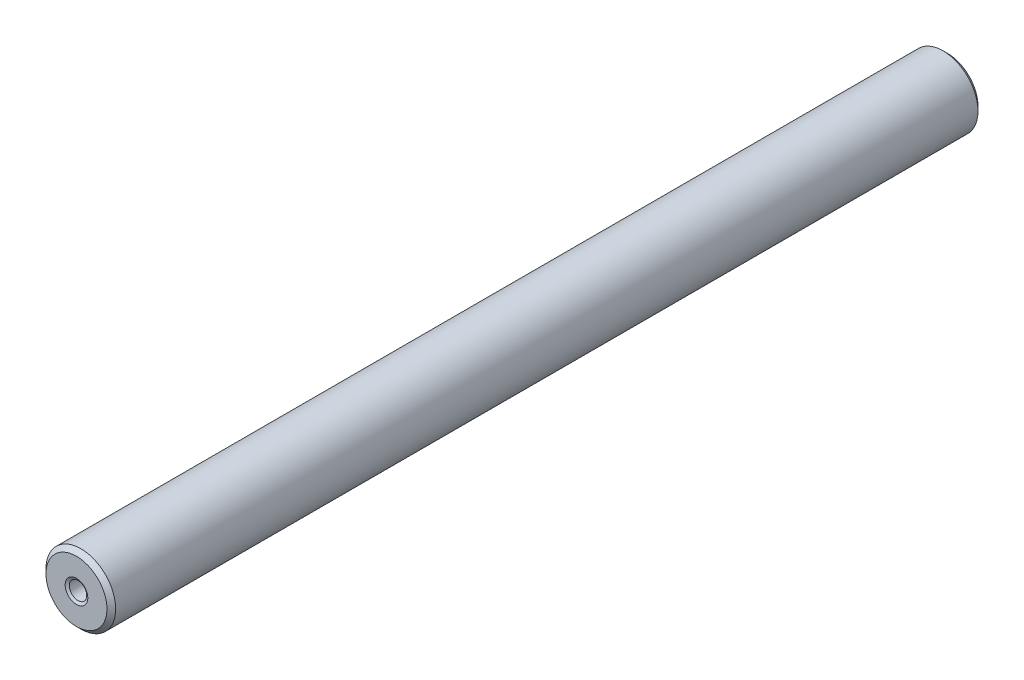
ISO-10303-21;
HEADER;
FILE_DESCRIPTION(('STEP AP214'),'2;1');
FILE_NAME('part.step','',(''),(''),'','','');
FILE_SCHEMA(('AUTOMOTIVE_DESIGN { 1 0 10303 214 1 1 1 1 }'));
ENDSEC;
DATA;
#1=APPLICATION_CONTEXT('core data for automotive mechanical design processes');
#2=APPLICATION_PROTOCOL_DEFINITION('international standard','automotive_design',2000,#1);
#3=PRODUCT_CONTEXT('',#1,'mechanical');
#4=PRODUCT('Part','Part','',(#3));
#5=PRODUCT_RELATED_PRODUCT_CATEGORY('part','',(#4));
#6=PRODUCT_DEFINITION_FORMATION('','',#4);
#7=PRODUCT_DEFINITION_CONTEXT('part definition',#1,'design');
#8=PRODUCT_DEFINITION('design','',#6,#7);
#9=PRODUCT_DEFINITION_SHAPE('','',#8);
#10=(LENGTH_UNIT() NAMED_UNIT(*) SI_UNIT(.MILLI.,.METRE.));
#11=(NAMED_UNIT(*) PLANE_ANGLE_UNIT() SI_UNIT($,.RADIAN.));
#12=(NAMED_UNIT(*) SI_UNIT($,.STERADIAN.) SOLID_ANGLE_UNIT());
#13=UNCERTAINTY_MEASURE_WITH_UNIT(LENGTH_MEASURE(1.E-05),#10,'distance_accuracy_value','');
#14=(GEOMETRIC_REPRESENTATION_CONTEXT(3) GLOBAL_UNCERTAINTY_ASSIGNED_CONTEXT((#13)) GLOBAL_UNIT_ASSIGNED_CONTEXT((#10,
#11,#12)) REPRESENTATION_CONTEXT('',''));
#15=CARTESIAN_POINT('',(0.,0.,0.));
#16=DIRECTION('',(0.,0.,1.));
#17=DIRECTION('',(1.,0.,0.));
#18=AXIS2_PLACEMENT_3D('',#15,#16,#17);
#19=CARTESIAN_POINT('',(0.,0.,98.));
#20=DIRECTION('',(0.,0.,1.));
#21=DIRECTION('',(1.,0.,0.));
#22=AXIS2_PLACEMENT_3D('',#19,#20,#21);
#23=CYLINDRICAL_SURFACE('',#22,1.);
#24=CARTESIAN_POINT('',(0.,0.,1.8267949192431));
#25=DIRECTION('',(0.,0.,1.));
#26=DIRECTION('',(1.,0.,0.));
#27=AXIS2_PLACEMENT_3D('',#24,#25,#26);
#28=CIRCLE('',#27,1.);
#29=CARTESIAN_POINT('',(1.,0.,1.8267949192431));
#30=VERTEX_POINT('',#29);
#31=EDGE_CURVE('E56',#30,#30,#28,.T.);
#32=ORIENTED_EDGE('',*,*,#31,.T.);
#33=EDGE_LOOP('',(#32));
#34=FACE_BOUND('',#33,.T.);
#35=CARTESIAN_POINT('',(0.,0.,0.300000000000009));
#36=DIRECTION('',(0.,0.,1.));
#37=DIRECTION('',(1.,0.,0.));
#38=AXIS2_PLACEMENT_3D('',#35,#36,#37);
#39=CIRCLE('',#38,1.);
#40=CARTESIAN_POINT('',(1.,0.,0.300000000000008));
#41=VERTEX_POINT('',#40);
#42=EDGE_CURVE('E59',#41,#41,#39,.F.);
#43=ORIENTED_EDGE('',*,*,#42,.T.);
#44=EDGE_LOOP('',(#43));
#45=FACE_BOUND('',#44,.T.);
#46=ADVANCED_FACE('F30',(#34,#45),#23,.F.);
#47=CARTESIAN_POINT('',(-1.,0.,0.));
#48=DIRECTION('',(0.,0.,1.));
#49=DIRECTION('',(1.,0.,0.));
#50=AXIS2_PLACEMENT_3D('',#47,#48,#49);
#51=PLANE('',#50);
#52=CARTESIAN_POINT('',(0.,0.,0.));
#53=DIRECTION('',(0.,0.,1.));
#54=DIRECTION('',(1.,0.,0.));
#55=AXIS2_PLACEMENT_3D('',#52,#53,#54);
#56=CIRCLE('',#55,1.17320508075688);
#57=CARTESIAN_POINT('',(1.17320508075688,0.,0.));
#58=VERTEX_POINT('',#57);
#59=EDGE_CURVE('E50',#58,#58,#56,.T.);
#60=ORIENTED_EDGE('',*,*,#59,.T.);
#61=EDGE_LOOP('',(#60));
#62=FACE_BOUND('',#61,.T.);
#63=CARTESIAN_POINT('',(0.,0.,0.));
#64=DIRECTION('',(0.,0.,1.));
#65=DIRECTION('',(1.,0.,0.));
#66=AXIS2_PLACEMENT_3D('',#63,#64,#65);
#67=CIRCLE('',#66,3.5);
#68=CARTESIAN_POINT('',(3.5,0.,0.));
#69=VERTEX_POINT('',#68);
#70=EDGE_CURVE('E65',#69,#69,#67,.F.);
#71=ORIENTED_EDGE('',*,*,#70,.T.);
#72=EDGE_LOOP('',(#71));
#73=FACE_BOUND('',#72,.T.);
#74=ADVANCED_FACE('F95',(#62,#73),#51,.F.);
#75=CARTESIAN_POINT('',(0.,0.,98.));
#76=DIRECTION('',(0.,0.,1.));
#77=DIRECTION('',(1.,0.,0.));
#78=AXIS2_PLACEMENT_3D('',#75,#76,#77);
#79=CYLINDRICAL_SURFACE('',#78,4.);
#80=CARTESIAN_POINT('',(0.,0.,0.5));
#81=DIRECTION('',(0.,0.,1.));
#82=DIRECTION('',(1.,0.,0.));
#83=AXIS2_PLACEMENT_3D('',#80,#81,#82);
#84=CIRCLE('',#83,4.);
#85=CARTESIAN_POINT('',(4.,0.,0.5));
#86=VERTEX_POINT('',#85);
#87=EDGE_CURVE('E68',#86,#86,#84,.T.);
#88=ORIENTED_EDGE('',*,*,#87,.T.);
#89=EDGE_LOOP('',(#88));
#90=FACE_BOUND('',#89,.T.);
#91=CARTESIAN_POINT('',(0.,0.,99.5));
#92=DIRECTION('',(0.,0.,-1.));
#93=DIRECTION('',(-1.,0.,0.));
#94=AXIS2_PLACEMENT_3D('',#91,#92,#93);
#95=CIRCLE('',#94,4.);
#96=CARTESIAN_POINT('',(-3.99999999999999,0.,99.5));
#97=VERTEX_POINT('',#96);
#98=EDGE_CURVE('E71',#97,#97,#95,.T.);
#99=ORIENTED_EDGE('',*,*,#98,.T.);
#100=EDGE_LOOP('',(#99));
#101=FACE_BOUND('',#100,.T.);
#102=ADVANCED_FACE('F75',(#90,#101),#79,.T.);
#103=CARTESIAN_POINT('',(-3.99999999999999,0.,100.));
#104=DIRECTION('',(0.,0.,-1.));
#105=DIRECTION('',(-1.,0.,0.));
#106=AXIS2_PLACEMENT_3D('',#103,#104,#105);
#107=PLANE('',#106);
#108=CARTESIAN_POINT('',(0.,0.,100.));
#109=DIRECTION('',(0.,0.,-1.));
#110=DIRECTION('',(-1.,0.,0.));
#111=AXIS2_PLACEMENT_3D('',#108,#109,#110);
#112=CIRCLE('',#111,1.29999999999999);
#113=CARTESIAN_POINT('',(-1.29999999999998,0.,100.));
#114=VERTEX_POINT('',#113);
#115=EDGE_CURVE('E10',#114,#114,#112,.T.);
#116=ORIENTED_EDGE('',*,*,#115,.T.);
#117=EDGE_LOOP('',(#116));
#118=FACE_BOUND('',#117,.T.);
#119=CARTESIAN_POINT('',(0.,0.,100.));
#120=DIRECTION('',(0.,0.,-1.));
#121=DIRECTION('',(-1.,0.,0.));
#122=AXIS2_PLACEMENT_3D('',#119,#120,#121);
#123=CIRCLE('',#122,3.49999999999999);
#124=CARTESIAN_POINT('',(-3.49999999999997,0.,100.));
#125=VERTEX_POINT('',#124);
#126=EDGE_CURVE('E62',#125,#125,#123,.F.);
#127=ORIENTED_EDGE('',*,*,#126,.T.);
#128=EDGE_LOOP('',(#127));
#129=FACE_BOUND('',#128,.T.);
#130=ADVANCED_FACE('F85',(#118,#129),#107,.F.);
#131=CARTESIAN_POINT('',(0.,0.,98.));
#132=DIRECTION('',(0.,0.,1.));
#133=DIRECTION('',(1.,0.,0.));
#134=AXIS2_PLACEMENT_3D('',#131,#132,#133);
#135=CYLINDRICAL_SURFACE('',#134,1.);
#136=CARTESIAN_POINT('',(0.,0.,98.3));
#137=DIRECTION('',(0.,0.,-1.));
#138=DIRECTION('',(-1.,0.,0.));
#139=AXIS2_PLACEMENT_3D('',#136,#137,#138);
#140=CIRCLE('',#139,1.);
#141=CARTESIAN_POINT('',(-0.999999999999988,0.,98.3));
#142=VERTEX_POINT('',#141);
#143=EDGE_CURVE('E37',#142,#142,#140,.T.);
#144=ORIENTED_EDGE('',*,*,#143,.T.);
#145=EDGE_LOOP('',(#144));
#146=FACE_BOUND('',#145,.T.);
#147=CARTESIAN_POINT('',(0.,0.,99.8267949192431));
#148=DIRECTION('',(0.,0.,-1.));
#149=DIRECTION('',(-1.,0.,0.));
#150=AXIS2_PLACEMENT_3D('',#147,#148,#149);
#151=CIRCLE('',#150,1.);
#152=CARTESIAN_POINT('',(-0.999999999999988,0.,99.8267949192431));
#153=VERTEX_POINT('',#152);
#154=EDGE_CURVE('E41',#153,#153,#151,.F.);
#155=ORIENTED_EDGE('',*,*,#154,.T.);
#156=EDGE_LOOP('',(#155));
#157=FACE_BOUND('',#156,.T.);
#158=ADVANCED_FACE('F87',(#146,#157),#135,.F.);
#159=CARTESIAN_POINT('',(0.,0.,98.));
#160=DIRECTION('',(0.,0.,-1.));
#161=DIRECTION('',(-1.,0.,0.));
#162=AXIS2_PLACEMENT_3D('',#159,#160,#161);
#163=PLANE('',#162);
#164=CARTESIAN_POINT('',(0.,0.,98.));
#165=DIRECTION('',(0.,0.,-1.));
#166=DIRECTION('',(-1.,0.,0.));
#167=AXIS2_PLACEMENT_3D('',#164,#165,#166);
#168=CIRCLE('',#167,0.826794919243104);
#169=CARTESIAN_POINT('',(-0.82679491924309,0.,98.));
#170=VERTEX_POINT('',#169);
#171=EDGE_CURVE('E45',#170,#170,#168,.F.);
#172=ORIENTED_EDGE('',*,*,#171,.T.);
#173=EDGE_LOOP('',(#172));
#174=FACE_BOUND('',#173,.T.);
#175=ADVANCED_FACE('F93',(#174),#163,.F.);
#176=CARTESIAN_POINT('',(0.,0.,2.));
#177=DIRECTION('',(0.,0.,1.));
#178=DIRECTION('',(1.,0.,0.));
#179=AXIS2_PLACEMENT_3D('',#176,#177,#178);
#180=PLANE('',#179);
#181=CARTESIAN_POINT('',(0.,0.,2.));
#182=DIRECTION('',(0.,0.,1.));
#183=DIRECTION('',(1.,0.,0.));
#184=AXIS2_PLACEMENT_3D('',#181,#182,#183);
#185=CIRCLE('',#184,0.699999999999995);
#186=CARTESIAN_POINT('',(0.699999999999995,0.,2.));
#187=VERTEX_POINT('',#186);
#188=EDGE_CURVE('E53',#187,#187,#185,.F.);
#189=ORIENTED_EDGE('',*,*,#188,.T.);
#190=EDGE_LOOP('',(#189));
#191=FACE_BOUND('',#190,.T.);
#192=ADVANCED_FACE('F109',(#191),#180,.F.);
#193=CARTESIAN_POINT('',(0.,0.,0.5));
#194=DIRECTION('',(0.,0.,1.));
#195=DIRECTION('',(1.,0.,0.));
#196=AXIS2_PLACEMENT_3D('',#193,#194,#195);
#197=CONICAL_SURFACE('',#196,4.,0.785398163397447);
#198=ORIENTED_EDGE('',*,*,#70,.F.);
#199=EDGE_LOOP('',(#198));
#200=FACE_BOUND('',#199,.T.);
#201=ORIENTED_EDGE('',*,*,#87,.F.);
#202=EDGE_LOOP('',(#201));
#203=FACE_BOUND('',#202,.T.);
#204=ADVANCED_FACE('F81',(#200,#203),#197,.T.);
#205=CARTESIAN_POINT('',(0.,0.,100.));
#206=DIRECTION('',(0.,0.,-1.));
#207=DIRECTION('',(-1.,0.,0.));
#208=AXIS2_PLACEMENT_3D('',#205,#206,#207);
#209=CONICAL_SURFACE('',#208,3.49999999999999,0.785398163397461);
#210=ORIENTED_EDGE('',*,*,#98,.F.);
#211=EDGE_LOOP('',(#210));
#212=FACE_BOUND('',#211,.T.);
#213=ORIENTED_EDGE('',*,*,#126,.F.);
#214=EDGE_LOOP('',(#213));
#215=FACE_BOUND('',#214,.T.);
#216=ADVANCED_FACE('F77',(#212,#215),#209,.T.);
#217=CARTESIAN_POINT('',(0.,0.,1.8267949192431));
#218=DIRECTION('',(0.,0.,-1.));
#219=DIRECTION('',(-1.,0.,0.));
#220=AXIS2_PLACEMENT_3D('',#217,#218,#219);
#221=CONICAL_SURFACE('',#220,1.,1.04719755119659);
#222=ORIENTED_EDGE('',*,*,#188,.F.);
#223=EDGE_LOOP('',(#222));
#224=FACE_BOUND('',#223,.T.);
#225=ORIENTED_EDGE('',*,*,#31,.F.);
#226=EDGE_LOOP('',(#225));
#227=FACE_BOUND('',#226,.T.);
#228=ADVANCED_FACE('F80',(#224,#227),#221,.F.);
#229=CARTESIAN_POINT('',(0.,0.,0.));
#230=DIRECTION('',(0.,0.,-1.));
#231=DIRECTION('',(-1.,0.,0.));
#232=AXIS2_PLACEMENT_3D('',#229,#230,#231);
#233=CONICAL_SURFACE('',#232,1.17320508075688,0.523598775598276);
#234=ORIENTED_EDGE('',*,*,#42,.F.);
#235=EDGE_LOOP('',(#234));
#236=FACE_BOUND('',#235,.T.);
#237=ORIENTED_EDGE('',*,*,#59,.F.);
#238=EDGE_LOOP('',(#237));
#239=FACE_BOUND('',#238,.T.);
#240=ADVANCED_FACE('F114',(#236,#239),#233,.F.);
#241=CARTESIAN_POINT('',(0.,0.,98.));
#242=DIRECTION('',(0.,0.,1.));
#243=DIRECTION('',(1.,0.,0.));
#244=AXIS2_PLACEMENT_3D('',#241,#242,#243);
#245=CONICAL_SURFACE('',#244,0.826794919243104,0.523598775598313);
#246=ORIENTED_EDGE('',*,*,#143,.F.);
#247=EDGE_LOOP('',(#246));
#248=FACE_BOUND('',#247,.T.);
#249=ORIENTED_EDGE('',*,*,#171,.F.);
#250=EDGE_LOOP('',(#249));
#251=FACE_BOUND('',#250,.T.);
#252=ADVANCED_FACE('F117',(#248,#251),#245,.F.);
#253=CARTESIAN_POINT('',(0.,0.,99.8267949192431));
#254=DIRECTION('',(0.,0.,1.));
#255=DIRECTION('',(1.,0.,0.));
#256=AXIS2_PLACEMENT_3D('',#253,#254,#255);
#257=CONICAL_SURFACE('',#256,1.,1.0471975511966);
#258=ORIENTED_EDGE('',*,*,#115,.F.);
#259=EDGE_LOOP('',(#258));
#260=FACE_BOUND('',#259,.T.);
#261=ORIENTED_EDGE('',*,*,#154,.F.);
#262=EDGE_LOOP('',(#261));
#263=FACE_BOUND('',#262,.T.);
#264=ADVANCED_FACE('F32',(#260,#263),#257,.F.);
#265=CLOSED_SHELL('',(#46,#74,#102,#130,#158,#175,#192,#204,#216,#228,#240,#252,#264));
#266=MANIFOLD_SOLID_BREP('B2',#265);
#267=ADVANCED_BREP_SHAPE_REPRESENTATION('',(#18,#266),#14);
#268=SHAPE_DEFINITION_REPRESENTATION(#9,#267);
ENDSEC;
END-ISO-10303-21;
